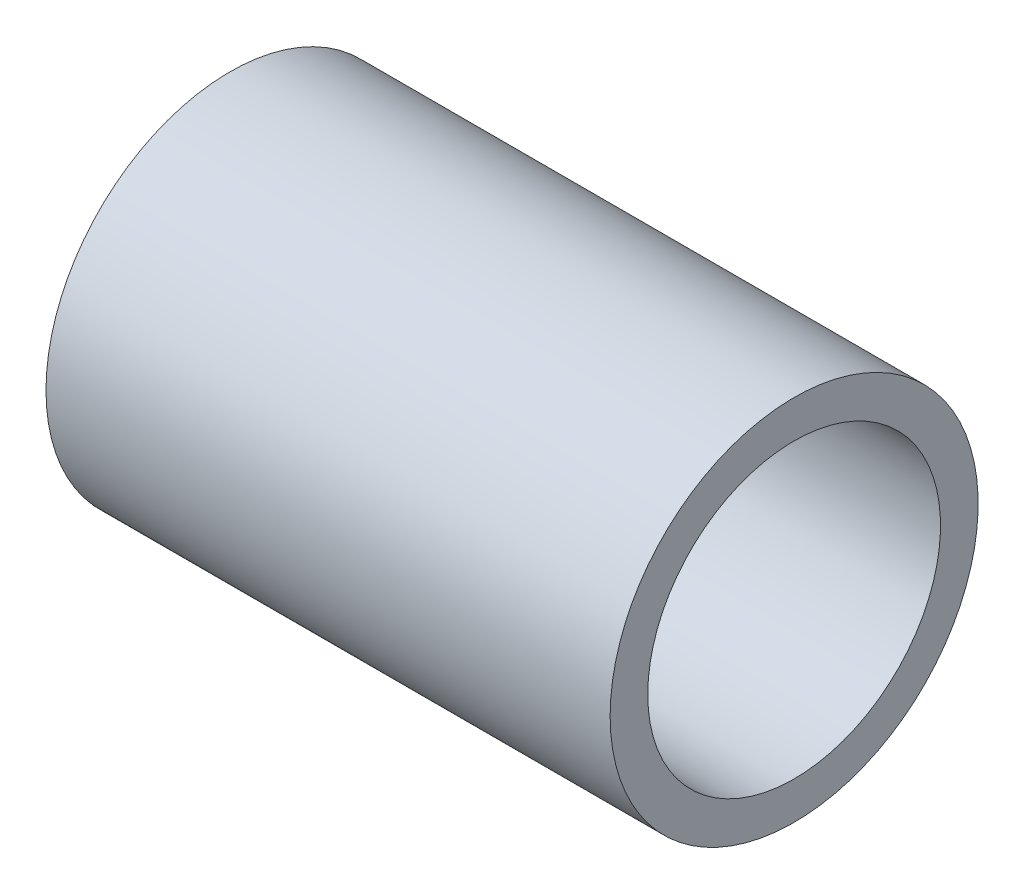
ISO-10303-21;
HEADER;
FILE_DESCRIPTION(('STEP AP214'),'2;1');
FILE_NAME('part.step','',(''),(''),'','','');
FILE_SCHEMA(('AUTOMOTIVE_DESIGN { 1 0 10303 214 1 1 1 1 }'));
ENDSEC;
DATA;
#1=APPLICATION_CONTEXT('core data for automotive mechanical design processes');
#2=APPLICATION_PROTOCOL_DEFINITION('international standard','automotive_design',2000,#1);
#3=PRODUCT_CONTEXT('',#1,'mechanical');
#4=PRODUCT('Part','Part','',(#3));
#5=PRODUCT_RELATED_PRODUCT_CATEGORY('part','',(#4));
#6=PRODUCT_DEFINITION_FORMATION('','',#4);
#7=PRODUCT_DEFINITION_CONTEXT('part definition',#1,'design');
#8=PRODUCT_DEFINITION('design','',#6,#7);
#9=PRODUCT_DEFINITION_SHAPE('','',#8);
#10=(LENGTH_UNIT() NAMED_UNIT(*) SI_UNIT(.MILLI.,.METRE.));
#11=(NAMED_UNIT(*) PLANE_ANGLE_UNIT() SI_UNIT($,.RADIAN.));
#12=(NAMED_UNIT(*) SI_UNIT($,.STERADIAN.) SOLID_ANGLE_UNIT());
#13=UNCERTAINTY_MEASURE_WITH_UNIT(LENGTH_MEASURE(1.E-05),#10,'distance_accuracy_value','');
#14=(GEOMETRIC_REPRESENTATION_CONTEXT(3) GLOBAL_UNCERTAINTY_ASSIGNED_CONTEXT((#13)) GLOBAL_UNIT_ASSIGNED_CONTEXT((#10,
#11,#12)) REPRESENTATION_CONTEXT('',''));
#15=CARTESIAN_POINT('',(0.,0.,0.));
#16=DIRECTION('',(0.,0.,1.));
#17=DIRECTION('',(1.,0.,0.));
#18=AXIS2_PLACEMENT_3D('',#15,#16,#17);
#19=CARTESIAN_POINT('',(-20.7518,0.,0.));
#20=DIRECTION('',(-1.,0.,0.));
#21=DIRECTION('',(0.,0.,1.));
#22=AXIS2_PLACEMENT_3D('',#19,#20,#21);
#23=CYLINDRICAL_SURFACE('',#22,13.5382);
#24=CARTESIAN_POINT('',(20.7518,0.,0.));
#25=DIRECTION('',(-1.,0.,0.));
#26=DIRECTION('',(0.,0.,1.));
#27=AXIS2_PLACEMENT_3D('',#24,#25,#26);
#28=CIRCLE('',#27,13.5382);
#29=CARTESIAN_POINT('',(20.7518,0.,13.5382));
#30=VERTEX_POINT('',#29);
#31=EDGE_CURVE('E58',#30,#30,#28,.T.);
#32=ORIENTED_EDGE('',*,*,#31,.T.);
#33=EDGE_LOOP('',(#32));
#34=FACE_BOUND('',#33,.T.);
#35=CARTESIAN_POINT('',(-20.7518,0.,0.));
#36=DIRECTION('',(-1.,0.,0.));
#37=DIRECTION('',(0.,0.,1.));
#38=AXIS2_PLACEMENT_3D('',#35,#36,#37);
#39=CIRCLE('',#38,13.5382);
#40=CARTESIAN_POINT('',(-20.7518,0.,13.5382));
#41=VERTEX_POINT('',#40);
#42=EDGE_CURVE('E10',#41,#41,#39,.T.);
#43=ORIENTED_EDGE('',*,*,#42,.F.);
#44=EDGE_LOOP('',(#43));
#45=FACE_BOUND('',#44,.T.);
#46=ADVANCED_FACE('F30',(#34,#45),#23,.T.);
#47=CARTESIAN_POINT('',(-20.7518,-13.5382,0.));
#48=DIRECTION('',(-1.,0.,0.));
#49=DIRECTION('',(0.,0.,1.));
#50=AXIS2_PLACEMENT_3D('',#47,#48,#49);
#51=PLANE('',#50);
#52=ORIENTED_EDGE('',*,*,#42,.T.);
#53=EDGE_LOOP('',(#52));
#54=FACE_BOUND('',#53,.T.);
#55=CARTESIAN_POINT('',(-20.7518,0.,0.));
#56=DIRECTION('',(-1.,0.,0.));
#57=DIRECTION('',(0.,0.,1.));
#58=AXIS2_PLACEMENT_3D('',#55,#56,#57);
#59=CIRCLE('',#58,10.7696);
#60=CARTESIAN_POINT('',(-20.7518,0.,10.7696));
#61=VERTEX_POINT('',#60);
#62=EDGE_CURVE('E36',#61,#61,#59,.T.);
#63=ORIENTED_EDGE('',*,*,#62,.F.);
#64=EDGE_LOOP('',(#63));
#65=FACE_BOUND('',#64,.T.);
#66=ADVANCED_FACE('F76',(#54,#65),#51,.T.);
#67=CARTESIAN_POINT('',(-1.1938,0.,0.));
#68=DIRECTION('',(-1.,0.,0.));
#69=DIRECTION('',(0.,0.,1.));
#70=AXIS2_PLACEMENT_3D('',#67,#68,#69);
#71=CONICAL_SURFACE('',#70,10.6172,0.00779205008755761);
#72=ORIENTED_EDGE('',*,*,#62,.T.);
#73=EDGE_LOOP('',(#72));
#74=FACE_BOUND('',#73,.T.);
#75=CARTESIAN_POINT('',(-1.1938,0.,0.));
#76=DIRECTION('',(-1.,0.,0.));
#77=DIRECTION('',(0.,0.,1.));
#78=AXIS2_PLACEMENT_3D('',#75,#76,#77);
#79=CIRCLE('',#78,10.6172);
#80=CARTESIAN_POINT('',(-1.1938,0.,10.6172));
#81=VERTEX_POINT('',#80);
#82=EDGE_CURVE('E40',#81,#81,#79,.T.);
#83=ORIENTED_EDGE('',*,*,#82,.F.);
#84=EDGE_LOOP('',(#83));
#85=FACE_BOUND('',#84,.T.);
#86=ADVANCED_FACE('F80',(#74,#85),#71,.F.);
#87=CARTESIAN_POINT('',(-1.1938,-10.6172,0.));
#88=DIRECTION('',(-1.,0.,0.));
#89=DIRECTION('',(0.,0.,1.));
#90=AXIS2_PLACEMENT_3D('',#87,#88,#89);
#91=PLANE('',#90);
#92=ORIENTED_EDGE('',*,*,#82,.T.);
#93=EDGE_LOOP('',(#92));
#94=FACE_BOUND('',#93,.T.);
#95=CARTESIAN_POINT('',(-1.1938,0.,0.));
#96=DIRECTION('',(-1.,0.,0.));
#97=DIRECTION('',(0.,0.,1.));
#98=AXIS2_PLACEMENT_3D('',#95,#96,#97);
#99=CIRCLE('',#98,7.8994);
#100=CARTESIAN_POINT('',(-1.1938,0.,7.8994));
#101=VERTEX_POINT('',#100);
#102=EDGE_CURVE('E44',#101,#101,#99,.T.);
#103=ORIENTED_EDGE('',*,*,#102,.F.);
#104=EDGE_LOOP('',(#103));
#105=FACE_BOUND('',#104,.T.);
#106=ADVANCED_FACE('F84',(#94,#105),#91,.T.);
#107=CARTESIAN_POINT('',(-20.7518,0.,0.));
#108=DIRECTION('',(-1.,0.,0.));
#109=DIRECTION('',(0.,0.,1.));
#110=AXIS2_PLACEMENT_3D('',#107,#108,#109);
#111=CYLINDRICAL_SURFACE('',#110,7.8994);
#112=ORIENTED_EDGE('',*,*,#102,.T.);
#113=EDGE_LOOP('',(#112));
#114=FACE_BOUND('',#113,.T.);
#115=CARTESIAN_POINT('',(1.1938,0.,0.));
#116=DIRECTION('',(-1.,0.,0.));
#117=DIRECTION('',(0.,0.,1.));
#118=AXIS2_PLACEMENT_3D('',#115,#116,#117);
#119=CIRCLE('',#118,7.8994);
#120=CARTESIAN_POINT('',(1.1938,0.,7.8994));
#121=VERTEX_POINT('',#120);
#122=EDGE_CURVE('E49',#121,#121,#119,.T.);
#123=ORIENTED_EDGE('',*,*,#122,.F.);
#124=EDGE_LOOP('',(#123));
#125=FACE_BOUND('',#124,.T.);
#126=ADVANCED_FACE('F90',(#114,#125),#111,.F.);
#127=CARTESIAN_POINT('',(1.1938,-10.6172,0.));
#128=DIRECTION('',(1.,0.,0.));
#129=DIRECTION('',(0.,0.,-1.));
#130=AXIS2_PLACEMENT_3D('',#127,#128,#129);
#131=PLANE('',#130);
#132=ORIENTED_EDGE('',*,*,#122,.T.);
#133=EDGE_LOOP('',(#132));
#134=FACE_BOUND('',#133,.T.);
#135=CARTESIAN_POINT('',(1.1938,0.,0.));
#136=DIRECTION('',(-1.,0.,0.));
#137=DIRECTION('',(0.,0.,1.));
#138=AXIS2_PLACEMENT_3D('',#135,#136,#137);
#139=CIRCLE('',#138,10.6172);
#140=CARTESIAN_POINT('',(1.1938,0.,10.6172));
#141=VERTEX_POINT('',#140);
#142=EDGE_CURVE('E52',#141,#141,#139,.T.);
#143=ORIENTED_EDGE('',*,*,#142,.F.);
#144=EDGE_LOOP('',(#143));
#145=FACE_BOUND('',#144,.T.);
#146=ADVANCED_FACE('F72',(#134,#145),#131,.T.);
#147=CARTESIAN_POINT('',(20.7518,0.,0.));
#148=DIRECTION('',(1.,0.,0.));
#149=DIRECTION('',(0.,0.,-1.));
#150=AXIS2_PLACEMENT_3D('',#147,#148,#149);
#151=CONICAL_SURFACE('',#150,10.7696,0.00779205008755734);
#152=ORIENTED_EDGE('',*,*,#142,.T.);
#153=EDGE_LOOP('',(#152));
#154=FACE_BOUND('',#153,.T.);
#155=CARTESIAN_POINT('',(20.7518,0.,0.));
#156=DIRECTION('',(-1.,0.,0.));
#157=DIRECTION('',(0.,0.,1.));
#158=AXIS2_PLACEMENT_3D('',#155,#156,#157);
#159=CIRCLE('',#158,10.7696);
#160=CARTESIAN_POINT('',(20.7518,0.,10.7696));
#161=VERTEX_POINT('',#160);
#162=EDGE_CURVE('E55',#161,#161,#159,.T.);
#163=ORIENTED_EDGE('',*,*,#162,.F.);
#164=EDGE_LOOP('',(#163));
#165=FACE_BOUND('',#164,.T.);
#166=ADVANCED_FACE('F66',(#154,#165),#151,.F.);
#167=CARTESIAN_POINT('',(20.7518,-13.5382,0.));
#168=DIRECTION('',(1.,0.,0.));
#169=DIRECTION('',(0.,0.,-1.));
#170=AXIS2_PLACEMENT_3D('',#167,#168,#169);
#171=PLANE('',#170);
#172=ORIENTED_EDGE('',*,*,#162,.T.);
#173=EDGE_LOOP('',(#172));
#174=FACE_BOUND('',#173,.T.);
#175=ORIENTED_EDGE('',*,*,#31,.F.);
#176=EDGE_LOOP('',(#175));
#177=FACE_BOUND('',#176,.T.);
#178=ADVANCED_FACE('F64',(#174,#177),#171,.T.);
#179=CLOSED_SHELL('',(#46,#66,#86,#106,#126,#146,#166,#178));
#180=MANIFOLD_SOLID_BREP('B2',#179);
#181=ADVANCED_BREP_SHAPE_REPRESENTATION('',(#18,#180),#14);
#182=SHAPE_DEFINITION_REPRESENTATION(#9,#181);
ENDSEC;
END-ISO-10303-21;
